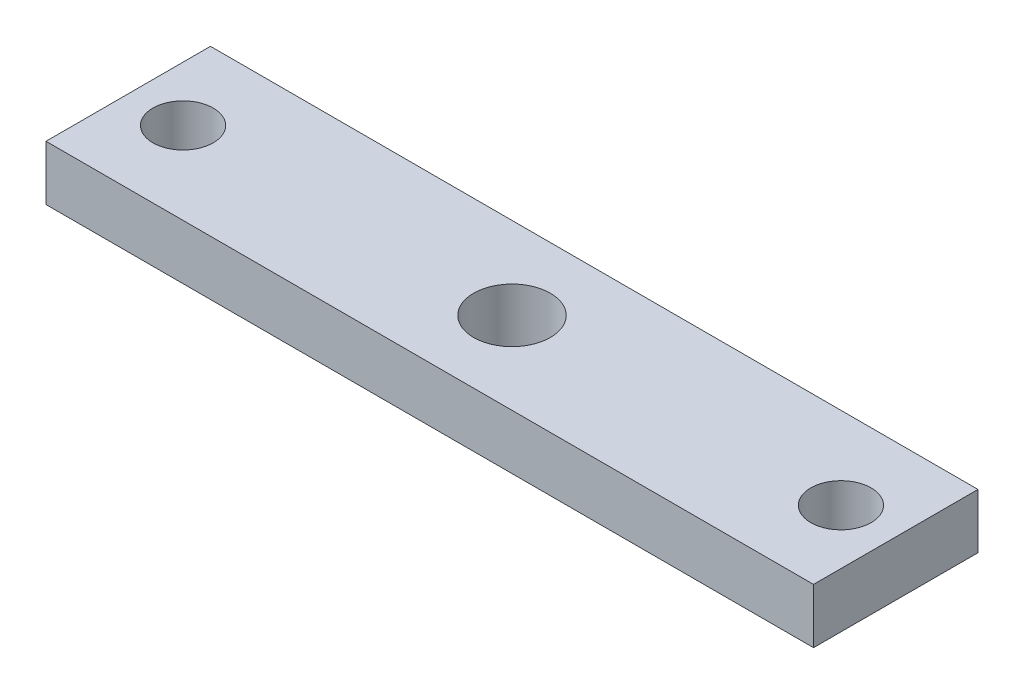
ISO-10303-21;
HEADER;
FILE_DESCRIPTION(('STEP AP214'),'2;1');
FILE_NAME('part.step','',(''),(''),'','','');
FILE_SCHEMA(('AUTOMOTIVE_DESIGN { 1 0 10303 214 1 1 1 1 }'));
ENDSEC;
DATA;
#1=APPLICATION_CONTEXT('core data for automotive mechanical design processes');
#2=APPLICATION_PROTOCOL_DEFINITION('international standard','automotive_design',2000,#1);
#3=PRODUCT_CONTEXT('',#1,'mechanical');
#4=PRODUCT('Part','Part','',(#3));
#5=PRODUCT_RELATED_PRODUCT_CATEGORY('part','',(#4));
#6=PRODUCT_DEFINITION_FORMATION('','',#4);
#7=PRODUCT_DEFINITION_CONTEXT('part definition',#1,'design');
#8=PRODUCT_DEFINITION('design','',#6,#7);
#9=PRODUCT_DEFINITION_SHAPE('','',#8);
#10=(LENGTH_UNIT() NAMED_UNIT(*) SI_UNIT(.MILLI.,.METRE.));
#11=(NAMED_UNIT(*) PLANE_ANGLE_UNIT() SI_UNIT($,.RADIAN.));
#12=(NAMED_UNIT(*) SI_UNIT($,.STERADIAN.) SOLID_ANGLE_UNIT());
#13=UNCERTAINTY_MEASURE_WITH_UNIT(LENGTH_MEASURE(1.E-05),#10,'distance_accuracy_value','');
#14=(GEOMETRIC_REPRESENTATION_CONTEXT(3) GLOBAL_UNCERTAINTY_ASSIGNED_CONTEXT((#13)) GLOBAL_UNIT_ASSIGNED_CONTEXT((#10,
#11,#12)) REPRESENTATION_CONTEXT('',''));
#15=CARTESIAN_POINT('',(0.,0.,0.));
#16=DIRECTION('',(0.,0.,1.));
#17=DIRECTION('',(1.,0.,0.));
#18=AXIS2_PLACEMENT_3D('',#15,#16,#17);
#19=CARTESIAN_POINT('',(70.,10.,-15.));
#20=DIRECTION('',(-1.,0.,0.));
#21=DIRECTION('',(0.,0.,1.));
#22=AXIS2_PLACEMENT_3D('',#19,#20,#21);
#23=PLANE('',#22);
#24=DIRECTION('',(0.,0.,-1.));
#25=VECTOR('',#24,1.);
#26=CARTESIAN_POINT('',(70.,0.,-15.));
#27=LINE('',#26,#25);
#28=CARTESIAN_POINT('',(70.,0.,15.));
#29=VERTEX_POINT('',#28);
#30=CARTESIAN_POINT('',(70.,0.,-15.));
#31=VERTEX_POINT('',#30);
#32=EDGE_CURVE('E105',#29,#31,#27,.T.);
#33=ORIENTED_EDGE('',*,*,#32,.T.);
#34=DIRECTION('',(0.,-1.,0.));
#35=VECTOR('',#34,1.);
#36=CARTESIAN_POINT('',(70.,10.,-15.));
#37=LINE('',#36,#35);
#38=CARTESIAN_POINT('',(70.,10.,-15.));
#39=VERTEX_POINT('',#38);
#40=EDGE_CURVE('E11',#39,#31,#37,.T.);
#41=ORIENTED_EDGE('',*,*,#40,.F.);
#42=DIRECTION('',(0.,0.,-1.));
#43=VECTOR('',#42,1.);
#44=CARTESIAN_POINT('',(70.,10.,-15.));
#45=LINE('',#44,#43);
#46=CARTESIAN_POINT('',(70.,10.,15.));
#47=VERTEX_POINT('',#46);
#48=EDGE_CURVE('E93',#47,#39,#45,.T.);
#49=ORIENTED_EDGE('',*,*,#48,.F.);
#50=DIRECTION('',(0.,-1.,0.));
#51=VECTOR('',#50,1.);
#52=CARTESIAN_POINT('',(70.,10.,15.));
#53=LINE('',#52,#51);
#54=EDGE_CURVE('E101',#47,#29,#53,.T.);
#55=ORIENTED_EDGE('',*,*,#54,.T.);
#56=EDGE_LOOP('',(#33,#41,#49,#55));
#57=FACE_BOUND('',#56,.T.);
#58=ADVANCED_FACE('F42',(#57),#23,.F.);
#59=CARTESIAN_POINT('',(-70.,10.,-15.));
#60=DIRECTION('',(0.,0.,1.));
#61=DIRECTION('',(1.,0.,0.));
#62=AXIS2_PLACEMENT_3D('',#59,#60,#61);
#63=PLANE('',#62);
#64=DIRECTION('',(-1.,0.,0.));
#65=VECTOR('',#64,1.);
#66=CARTESIAN_POINT('',(-70.,0.,-15.));
#67=LINE('',#66,#65);
#68=CARTESIAN_POINT('',(-70.,0.,-15.));
#69=VERTEX_POINT('',#68);
#70=EDGE_CURVE('E97',#31,#69,#67,.T.);
#71=ORIENTED_EDGE('',*,*,#70,.T.);
#72=DIRECTION('',(0.,-1.,0.));
#73=VECTOR('',#72,1.);
#74=CARTESIAN_POINT('',(-70.,10.,-15.));
#75=LINE('',#74,#73);
#76=CARTESIAN_POINT('',(-70.,10.,-15.));
#77=VERTEX_POINT('',#76);
#78=EDGE_CURVE('E50',#77,#69,#75,.T.);
#79=ORIENTED_EDGE('',*,*,#78,.F.);
#80=DIRECTION('',(-1.,0.,0.));
#81=VECTOR('',#80,1.);
#82=CARTESIAN_POINT('',(-70.,10.,-15.));
#83=LINE('',#82,#81);
#84=EDGE_CURVE('E88',#39,#77,#83,.T.);
#85=ORIENTED_EDGE('',*,*,#84,.F.);
#86=ORIENTED_EDGE('',*,*,#40,.T.);
#87=EDGE_LOOP('',(#71,#79,#85,#86));
#88=FACE_BOUND('',#87,.T.);
#89=ADVANCED_FACE('F96',(#88),#63,.F.);
#90=CARTESIAN_POINT('',(-70.,10.,-15.));
#91=DIRECTION('',(1.,0.,0.));
#92=DIRECTION('',(0.,0.,-1.));
#93=AXIS2_PLACEMENT_3D('',#90,#91,#92);
#94=PLANE('',#93);
#95=DIRECTION('',(0.,0.,1.));
#96=VECTOR('',#95,1.);
#97=CARTESIAN_POINT('',(-70.,0.,-15.));
#98=LINE('',#97,#96);
#99=CARTESIAN_POINT('',(-70.,0.,15.));
#100=VERTEX_POINT('',#99);
#101=EDGE_CURVE('E75',#69,#100,#98,.T.);
#102=ORIENTED_EDGE('',*,*,#101,.T.);
#103=DIRECTION('',(0.,-1.,0.));
#104=VECTOR('',#103,1.);
#105=CARTESIAN_POINT('',(-70.,10.,15.));
#106=LINE('',#105,#104);
#107=CARTESIAN_POINT('',(-70.,10.,15.));
#108=VERTEX_POINT('',#107);
#109=EDGE_CURVE('E98',#108,#100,#106,.T.);
#110=ORIENTED_EDGE('',*,*,#109,.F.);
#111=DIRECTION('',(0.,0.,1.));
#112=VECTOR('',#111,1.);
#113=CARTESIAN_POINT('',(-70.,10.,-15.));
#114=LINE('',#113,#112);
#115=EDGE_CURVE('E91',#77,#108,#114,.T.);
#116=ORIENTED_EDGE('',*,*,#115,.F.);
#117=ORIENTED_EDGE('',*,*,#78,.T.);
#118=EDGE_LOOP('',(#102,#110,#116,#117));
#119=FACE_BOUND('',#118,.T.);
#120=ADVANCED_FACE('F99',(#119),#94,.F.);
#121=CARTESIAN_POINT('',(-70.,10.,15.));
#122=DIRECTION('',(0.,0.,-1.));
#123=DIRECTION('',(-1.,0.,0.));
#124=AXIS2_PLACEMENT_3D('',#121,#122,#123);
#125=PLANE('',#124);
#126=DIRECTION('',(1.,0.,0.));
#127=VECTOR('',#126,1.);
#128=CARTESIAN_POINT('',(-70.,0.,15.));
#129=LINE('',#128,#127);
#130=EDGE_CURVE('E81',#100,#29,#129,.T.);
#131=ORIENTED_EDGE('',*,*,#130,.T.);
#132=ORIENTED_EDGE('',*,*,#54,.F.);
#133=DIRECTION('',(1.,0.,0.));
#134=VECTOR('',#133,1.);
#135=CARTESIAN_POINT('',(-70.,10.,15.));
#136=LINE('',#135,#134);
#137=EDGE_CURVE('E58',#108,#47,#136,.T.);
#138=ORIENTED_EDGE('',*,*,#137,.F.);
#139=ORIENTED_EDGE('',*,*,#109,.T.);
#140=EDGE_LOOP('',(#131,#132,#138,#139));
#141=FACE_BOUND('',#140,.T.);
#142=ADVANCED_FACE('F113',(#141),#125,.F.);
#143=CARTESIAN_POINT('',(0.,10.,0.));
#144=DIRECTION('',(0.,1.,0.));
#145=DIRECTION('',(0.,0.,1.));
#146=AXIS2_PLACEMENT_3D('',#143,#144,#145);
#147=PLANE('',#146);
#148=CARTESIAN_POINT('',(0.,10.,0.));
#149=DIRECTION('',(0.,1.,0.));
#150=DIRECTION('',(0.,0.,1.));
#151=AXIS2_PLACEMENT_3D('',#148,#149,#150);
#152=CIRCLE('',#151,7.);
#153=CARTESIAN_POINT('',(0.,10.,7.));
#154=VERTEX_POINT('',#153);
#155=EDGE_CURVE('E133',#154,#154,#152,.T.);
#156=ORIENTED_EDGE('',*,*,#155,.F.);
#157=EDGE_LOOP('',(#156));
#158=FACE_BOUND('',#157,.T.);
#159=CARTESIAN_POINT('',(-60.,10.,0.));
#160=DIRECTION('',(0.,1.,0.));
#161=DIRECTION('',(0.,0.,1.));
#162=AXIS2_PLACEMENT_3D('',#159,#160,#161);
#163=CIRCLE('',#162,5.5);
#164=CARTESIAN_POINT('',(-60.,10.,5.5));
#165=VERTEX_POINT('',#164);
#166=EDGE_CURVE('E126',#165,#165,#163,.T.);
#167=ORIENTED_EDGE('',*,*,#166,.F.);
#168=EDGE_LOOP('',(#167));
#169=FACE_BOUND('',#168,.T.);
#170=CARTESIAN_POINT('',(60.,10.,0.));
#171=DIRECTION('',(0.,1.,0.));
#172=DIRECTION('',(0.,0.,1.));
#173=AXIS2_PLACEMENT_3D('',#170,#171,#172);
#174=CIRCLE('',#173,5.5);
#175=CARTESIAN_POINT('',(60.,10.,5.5));
#176=VERTEX_POINT('',#175);
#177=EDGE_CURVE('E119',#176,#176,#174,.T.);
#178=ORIENTED_EDGE('',*,*,#177,.F.);
#179=EDGE_LOOP('',(#178));
#180=FACE_BOUND('',#179,.T.);
#181=ORIENTED_EDGE('',*,*,#48,.T.);
#182=ORIENTED_EDGE('',*,*,#84,.T.);
#183=ORIENTED_EDGE('',*,*,#115,.T.);
#184=ORIENTED_EDGE('',*,*,#137,.T.);
#185=EDGE_LOOP('',(#181,#182,#183,#184));
#186=FACE_BOUND('',#185,.T.);
#187=ADVANCED_FACE('F89',(#158,#169,#180,#186),#147,.T.);
#188=CARTESIAN_POINT('',(0.,0.,0.));
#189=DIRECTION('',(0.,1.,0.));
#190=DIRECTION('',(0.,0.,1.));
#191=AXIS2_PLACEMENT_3D('',#188,#189,#190);
#192=PLANE('',#191);
#193=CARTESIAN_POINT('',(0.,0.,0.));
#194=DIRECTION('',(0.,1.,0.));
#195=DIRECTION('',(0.,0.,1.));
#196=AXIS2_PLACEMENT_3D('',#193,#194,#195);
#197=CIRCLE('',#196,7.);
#198=CARTESIAN_POINT('',(0.,0.,7.));
#199=VERTEX_POINT('',#198);
#200=EDGE_CURVE('E123',#199,#199,#197,.T.);
#201=ORIENTED_EDGE('',*,*,#200,.T.);
#202=EDGE_LOOP('',(#201));
#203=FACE_BOUND('',#202,.T.);
#204=CARTESIAN_POINT('',(-60.,0.,0.));
#205=DIRECTION('',(0.,1.,0.));
#206=DIRECTION('',(0.,0.,1.));
#207=AXIS2_PLACEMENT_3D('',#204,#205,#206);
#208=CIRCLE('',#207,5.5);
#209=CARTESIAN_POINT('',(-60.,0.,5.5));
#210=VERTEX_POINT('',#209);
#211=EDGE_CURVE('E108',#210,#210,#208,.T.);
#212=ORIENTED_EDGE('',*,*,#211,.T.);
#213=EDGE_LOOP('',(#212));
#214=FACE_BOUND('',#213,.T.);
#215=CARTESIAN_POINT('',(60.,0.,0.));
#216=DIRECTION('',(0.,1.,0.));
#217=DIRECTION('',(0.,0.,1.));
#218=AXIS2_PLACEMENT_3D('',#215,#216,#217);
#219=CIRCLE('',#218,5.5);
#220=CARTESIAN_POINT('',(60.,0.,5.5));
#221=VERTEX_POINT('',#220);
#222=EDGE_CURVE('E122',#221,#221,#219,.T.);
#223=ORIENTED_EDGE('',*,*,#222,.T.);
#224=EDGE_LOOP('',(#223));
#225=FACE_BOUND('',#224,.T.);
#226=ORIENTED_EDGE('',*,*,#32,.F.);
#227=ORIENTED_EDGE('',*,*,#130,.F.);
#228=ORIENTED_EDGE('',*,*,#101,.F.);
#229=ORIENTED_EDGE('',*,*,#70,.F.);
#230=EDGE_LOOP('',(#226,#227,#228,#229));
#231=FACE_BOUND('',#230,.T.);
#232=ADVANCED_FACE('F116',(#203,#214,#225,#231),#192,.F.);
#233=CARTESIAN_POINT('',(60.,0.,0.));
#234=DIRECTION('',(0.,1.,0.));
#235=DIRECTION('',(0.,0.,1.));
#236=AXIS2_PLACEMENT_3D('',#233,#234,#235);
#237=CYLINDRICAL_SURFACE('',#236,5.5);
#238=ORIENTED_EDGE('',*,*,#222,.F.);
#239=EDGE_LOOP('',(#238));
#240=FACE_BOUND('',#239,.T.);
#241=ORIENTED_EDGE('',*,*,#177,.T.);
#242=EDGE_LOOP('',(#241));
#243=FACE_BOUND('',#242,.T.);
#244=ADVANCED_FACE('F147',(#240,#243),#237,.F.);
#245=CARTESIAN_POINT('',(-60.,0.,0.));
#246=DIRECTION('',(0.,1.,0.));
#247=DIRECTION('',(0.,0.,1.));
#248=AXIS2_PLACEMENT_3D('',#245,#246,#247);
#249=CYLINDRICAL_SURFACE('',#248,5.5);
#250=ORIENTED_EDGE('',*,*,#211,.F.);
#251=EDGE_LOOP('',(#250));
#252=FACE_BOUND('',#251,.T.);
#253=ORIENTED_EDGE('',*,*,#166,.T.);
#254=EDGE_LOOP('',(#253));
#255=FACE_BOUND('',#254,.T.);
#256=ADVANCED_FACE('F149',(#252,#255),#249,.F.);
#257=CARTESIAN_POINT('',(0.,10.,0.));
#258=DIRECTION('',(0.,1.,0.));
#259=DIRECTION('',(0.,0.,1.));
#260=AXIS2_PLACEMENT_3D('',#257,#258,#259);
#261=CYLINDRICAL_SURFACE('',#260,7.);
#262=ORIENTED_EDGE('',*,*,#155,.T.);
#263=EDGE_LOOP('',(#262));
#264=FACE_BOUND('',#263,.T.);
#265=ORIENTED_EDGE('',*,*,#200,.F.);
#266=EDGE_LOOP('',(#265));
#267=FACE_BOUND('',#266,.T.);
#268=ADVANCED_FACE('F137',(#264,#267),#261,.F.);
#269=CLOSED_SHELL('',(#58,#89,#120,#142,#187,#232,#244,#256,#268));
#270=MANIFOLD_SOLID_BREP('B2',#269);
#271=ADVANCED_BREP_SHAPE_REPRESENTATION('',(#18,#270),#14);
#272=SHAPE_DEFINITION_REPRESENTATION(#9,#271);
ENDSEC;
END-ISO-10303-21;
